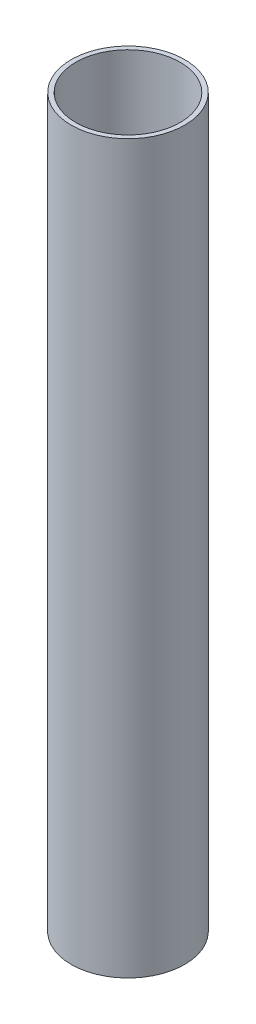
ISO-10303-21;
HEADER;
FILE_DESCRIPTION(('STEP AP214'),'2;1');
FILE_NAME('part.step','',(''),(''),'','','');
FILE_SCHEMA(('AUTOMOTIVE_DESIGN { 1 0 10303 214 1 1 1 1 }'));
ENDSEC;
DATA;
#1=APPLICATION_CONTEXT('core data for automotive mechanical design processes');
#2=APPLICATION_PROTOCOL_DEFINITION('international standard','automotive_design',2000,#1);
#3=PRODUCT_CONTEXT('',#1,'mechanical');
#4=PRODUCT('Part','Part','',(#3));
#5=PRODUCT_RELATED_PRODUCT_CATEGORY('part','',(#4));
#6=PRODUCT_DEFINITION_FORMATION('','',#4);
#7=PRODUCT_DEFINITION_CONTEXT('part definition',#1,'design');
#8=PRODUCT_DEFINITION('design','',#6,#7);
#9=PRODUCT_DEFINITION_SHAPE('','',#8);
#10=(LENGTH_UNIT() NAMED_UNIT(*) SI_UNIT(.MILLI.,.METRE.));
#11=(NAMED_UNIT(*) PLANE_ANGLE_UNIT() SI_UNIT($,.RADIAN.));
#12=(NAMED_UNIT(*) SI_UNIT($,.STERADIAN.) SOLID_ANGLE_UNIT());
#13=UNCERTAINTY_MEASURE_WITH_UNIT(LENGTH_MEASURE(1.E-05),#10,'distance_accuracy_value','');
#14=(GEOMETRIC_REPRESENTATION_CONTEXT(3) GLOBAL_UNCERTAINTY_ASSIGNED_CONTEXT((#13)) GLOBAL_UNIT_ASSIGNED_CONTEXT((#10,
#11,#12)) REPRESENTATION_CONTEXT('',''));
#15=CARTESIAN_POINT('',(0.,0.,0.));
#16=DIRECTION('',(0.,0.,1.));
#17=DIRECTION('',(1.,0.,0.));
#18=AXIS2_PLACEMENT_3D('',#15,#16,#17);
#19=CARTESIAN_POINT('',(0.,160.,0.));
#20=DIRECTION('',(0.,1.,0.));
#21=DIRECTION('',(0.,0.,1.));
#22=AXIS2_PLACEMENT_3D('',#19,#20,#21);
#23=PLANE('',#22);
#24=CARTESIAN_POINT('',(0.,160.,0.));
#25=DIRECTION('',(0.,1.,0.));
#26=DIRECTION('',(0.,0.,1.));
#27=AXIS2_PLACEMENT_3D('',#24,#25,#26);
#28=CIRCLE('',#27,12.5);
#29=CARTESIAN_POINT('',(0.,160.,12.5));
#30=VERTEX_POINT('',#29);
#31=EDGE_CURVE('E10',#30,#30,#28,.T.);
#32=ORIENTED_EDGE('',*,*,#31,.T.);
#33=EDGE_LOOP('',(#32));
#34=FACE_BOUND('',#33,.T.);
#35=CARTESIAN_POINT('',(0.,160.,0.));
#36=DIRECTION('',(0.,1.,0.));
#37=DIRECTION('',(0.,0.,1.));
#38=AXIS2_PLACEMENT_3D('',#35,#36,#37);
#39=CIRCLE('',#38,11.5);
#40=CARTESIAN_POINT('',(0.,160.,11.5));
#41=VERTEX_POINT('',#40);
#42=EDGE_CURVE('E56',#41,#41,#39,.T.);
#43=ORIENTED_EDGE('',*,*,#42,.F.);
#44=EDGE_LOOP('',(#43));
#45=FACE_BOUND('',#44,.T.);
#46=ADVANCED_FACE('F43',(#34,#45),#23,.T.);
#47=CARTESIAN_POINT('',(0.,0.,0.));
#48=DIRECTION('',(0.,1.,0.));
#49=DIRECTION('',(0.,0.,1.));
#50=AXIS2_PLACEMENT_3D('',#47,#48,#49);
#51=PLANE('',#50);
#52=CARTESIAN_POINT('',(0.,0.,0.));
#53=DIRECTION('',(0.,1.,0.));
#54=DIRECTION('',(0.,0.,1.));
#55=AXIS2_PLACEMENT_3D('',#52,#53,#54);
#56=CIRCLE('',#55,12.5);
#57=CARTESIAN_POINT('',(0.,0.,12.5));
#58=VERTEX_POINT('',#57);
#59=EDGE_CURVE('E47',#58,#58,#56,.T.);
#60=ORIENTED_EDGE('',*,*,#59,.F.);
#61=EDGE_LOOP('',(#60));
#62=FACE_BOUND('',#61,.T.);
#63=CARTESIAN_POINT('',(0.,0.,0.));
#64=DIRECTION('',(0.,1.,0.));
#65=DIRECTION('',(0.,0.,1.));
#66=AXIS2_PLACEMENT_3D('',#63,#64,#65);
#67=CIRCLE('',#66,11.5);
#68=CARTESIAN_POINT('',(0.,0.,11.5));
#69=VERTEX_POINT('',#68);
#70=EDGE_CURVE('E58',#69,#69,#67,.T.);
#71=ORIENTED_EDGE('',*,*,#70,.T.);
#72=EDGE_LOOP('',(#71));
#73=FACE_BOUND('',#72,.T.);
#74=ADVANCED_FACE('F70',(#62,#73),#51,.F.);
#75=CARTESIAN_POINT('',(0.,160.,0.));
#76=DIRECTION('',(0.,-1.,0.));
#77=DIRECTION('',(0.,0.,-1.));
#78=AXIS2_PLACEMENT_3D('',#75,#76,#77);
#79=CYLINDRICAL_SURFACE('',#78,12.5);
#80=ORIENTED_EDGE('',*,*,#31,.F.);
#81=EDGE_LOOP('',(#80));
#82=FACE_BOUND('',#81,.T.);
#83=ORIENTED_EDGE('',*,*,#59,.T.);
#84=EDGE_LOOP('',(#83));
#85=FACE_BOUND('',#84,.T.);
#86=ADVANCED_FACE('F45',(#82,#85),#79,.T.);
#87=CARTESIAN_POINT('',(0.,160.,0.));
#88=DIRECTION('',(0.,-1.,0.));
#89=DIRECTION('',(0.,0.,-1.));
#90=AXIS2_PLACEMENT_3D('',#87,#88,#89);
#91=CYLINDRICAL_SURFACE('',#90,11.5);
#92=ORIENTED_EDGE('',*,*,#42,.T.);
#93=EDGE_LOOP('',(#92));
#94=FACE_BOUND('',#93,.T.);
#95=ORIENTED_EDGE('',*,*,#70,.F.);
#96=EDGE_LOOP('',(#95));
#97=FACE_BOUND('',#96,.T.);
#98=ADVANCED_FACE('F66',(#94,#97),#91,.F.);
#99=CLOSED_SHELL('',(#46,#74,#86,#98));
#100=MANIFOLD_SOLID_BREP('B2',#99);
#101=ADVANCED_BREP_SHAPE_REPRESENTATION('',(#18,#100),#14);
#102=SHAPE_DEFINITION_REPRESENTATION(#9,#101);
ENDSEC;
END-ISO-10303-21;
